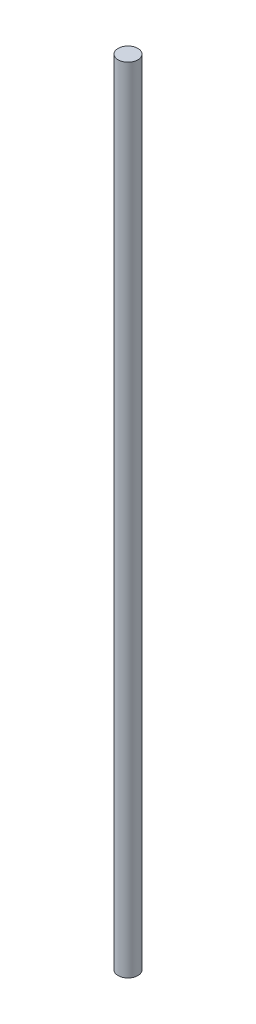
ISO-10303-21;
HEADER;
FILE_DESCRIPTION(('STEP AP214'),'2;1');
FILE_NAME('part.step','',(''),(''),'','','');
FILE_SCHEMA(('AUTOMOTIVE_DESIGN { 1 0 10303 214 1 1 1 1 }'));
ENDSEC;
DATA;
#1=APPLICATION_CONTEXT('core data for automotive mechanical design processes');
#2=APPLICATION_PROTOCOL_DEFINITION('international standard','automotive_design',2000,#1);
#3=PRODUCT_CONTEXT('',#1,'mechanical');
#4=PRODUCT('Part','Part','',(#3));
#5=PRODUCT_RELATED_PRODUCT_CATEGORY('part','',(#4));
#6=PRODUCT_DEFINITION_FORMATION('','',#4);
#7=PRODUCT_DEFINITION_CONTEXT('part definition',#1,'design');
#8=PRODUCT_DEFINITION('design','',#6,#7);
#9=PRODUCT_DEFINITION_SHAPE('','',#8);
#10=(LENGTH_UNIT() NAMED_UNIT(*) SI_UNIT(.MILLI.,.METRE.));
#11=(NAMED_UNIT(*) PLANE_ANGLE_UNIT() SI_UNIT($,.RADIAN.));
#12=(NAMED_UNIT(*) SI_UNIT($,.STERADIAN.) SOLID_ANGLE_UNIT());
#13=UNCERTAINTY_MEASURE_WITH_UNIT(LENGTH_MEASURE(1.E-05),#10,'distance_accuracy_value','');
#14=(GEOMETRIC_REPRESENTATION_CONTEXT(3) GLOBAL_UNCERTAINTY_ASSIGNED_CONTEXT((#13)) GLOBAL_UNIT_ASSIGNED_CONTEXT((#10,
#11,#12)) REPRESENTATION_CONTEXT('',''));
#15=CARTESIAN_POINT('',(0.,0.,0.));
#16=DIRECTION('',(0.,0.,1.));
#17=DIRECTION('',(1.,0.,0.));
#18=AXIS2_PLACEMENT_3D('',#15,#16,#17);
#19=CARTESIAN_POINT('',(0.,400.,0.));
#20=DIRECTION('',(0.,-1.,0.));
#21=DIRECTION('',(0.,0.,-1.));
#22=AXIS2_PLACEMENT_3D('',#19,#20,#21);
#23=CYLINDRICAL_SURFACE('',#22,5.);
#24=CARTESIAN_POINT('',(0.,400.,0.));
#25=DIRECTION('',(0.,1.,0.));
#26=DIRECTION('',(0.,0.,1.));
#27=AXIS2_PLACEMENT_3D('',#24,#25,#26);
#28=CIRCLE('',#27,5.);
#29=CARTESIAN_POINT('',(0.,400.,5.));
#30=VERTEX_POINT('',#29);
#31=EDGE_CURVE('E10',#30,#30,#28,.T.);
#32=ORIENTED_EDGE('',*,*,#31,.F.);
#33=EDGE_LOOP('',(#32));
#34=FACE_BOUND('',#33,.T.);
#35=CARTESIAN_POINT('',(0.,0.,0.));
#36=DIRECTION('',(0.,1.,0.));
#37=DIRECTION('',(0.,0.,1.));
#38=AXIS2_PLACEMENT_3D('',#35,#36,#37);
#39=CIRCLE('',#38,5.);
#40=CARTESIAN_POINT('',(0.,0.,5.));
#41=VERTEX_POINT('',#40);
#42=EDGE_CURVE('E34',#41,#41,#39,.T.);
#43=ORIENTED_EDGE('',*,*,#42,.T.);
#44=EDGE_LOOP('',(#43));
#45=FACE_BOUND('',#44,.T.);
#46=ADVANCED_FACE('F31',(#34,#45),#23,.T.);
#47=CARTESIAN_POINT('',(0.,400.,0.));
#48=DIRECTION('',(0.,1.,0.));
#49=DIRECTION('',(0.,0.,1.));
#50=AXIS2_PLACEMENT_3D('',#47,#48,#49);
#51=PLANE('',#50);
#52=ORIENTED_EDGE('',*,*,#31,.T.);
#53=EDGE_LOOP('',(#52));
#54=FACE_BOUND('',#53,.T.);
#55=ADVANCED_FACE('F46',(#54),#51,.T.);
#56=CARTESIAN_POINT('',(0.,0.,0.));
#57=DIRECTION('',(0.,1.,0.));
#58=DIRECTION('',(0.,0.,1.));
#59=AXIS2_PLACEMENT_3D('',#56,#57,#58);
#60=PLANE('',#59);
#61=ORIENTED_EDGE('',*,*,#42,.F.);
#62=EDGE_LOOP('',(#61));
#63=FACE_BOUND('',#62,.T.);
#64=ADVANCED_FACE('F44',(#63),#60,.F.);
#65=CLOSED_SHELL('',(#46,#55,#64));
#66=MANIFOLD_SOLID_BREP('B2',#65);
#67=ADVANCED_BREP_SHAPE_REPRESENTATION('',(#18,#66),#14);
#68=SHAPE_DEFINITION_REPRESENTATION(#9,#67);
ENDSEC;
END-ISO-10303-21;
